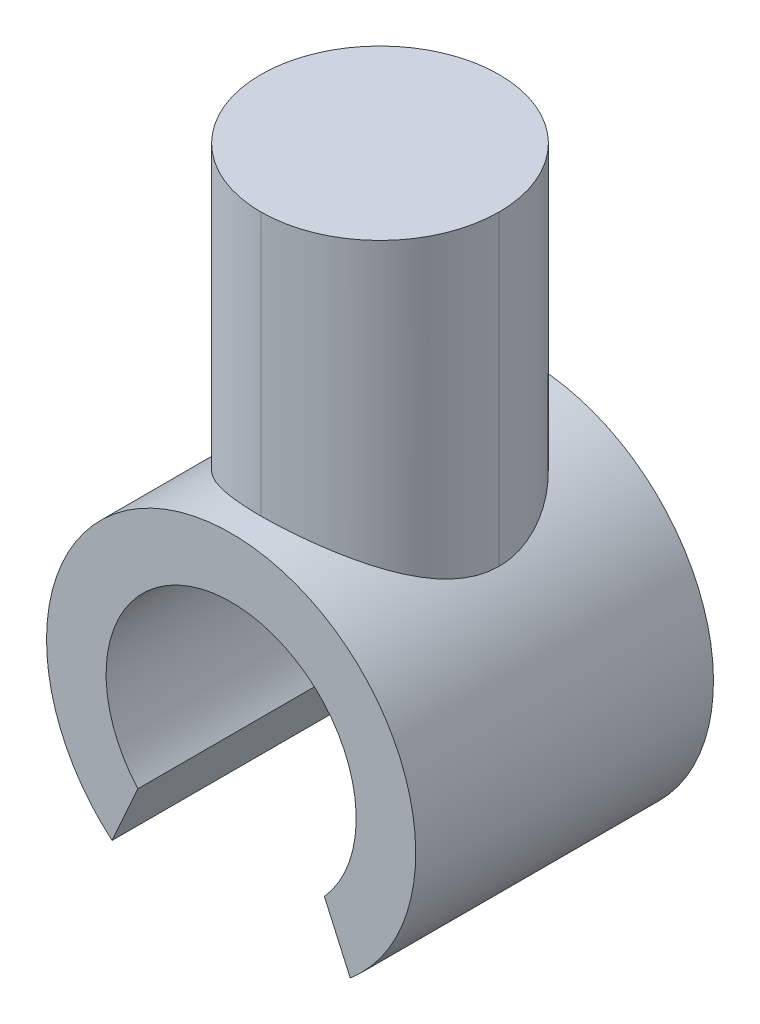
ISO-10303-21;
HEADER;
FILE_DESCRIPTION(('STEP AP214'),'2;1');
FILE_NAME('part.step','',(''),(''),'','','');
FILE_SCHEMA(('AUTOMOTIVE_DESIGN { 1 0 10303 214 1 1 1 1 }'));
ENDSEC;
DATA;
#1=APPLICATION_CONTEXT('core data for automotive mechanical design processes');
#2=APPLICATION_PROTOCOL_DEFINITION('international standard','automotive_design',2000,#1);
#3=PRODUCT_CONTEXT('',#1,'mechanical');
#4=PRODUCT('Part','Part','',(#3));
#5=PRODUCT_RELATED_PRODUCT_CATEGORY('part','',(#4));
#6=PRODUCT_DEFINITION_FORMATION('','',#4);
#7=PRODUCT_DEFINITION_CONTEXT('part definition',#1,'design');
#8=PRODUCT_DEFINITION('design','',#6,#7);
#9=PRODUCT_DEFINITION_SHAPE('','',#8);
#10=(LENGTH_UNIT() NAMED_UNIT(*) SI_UNIT(.MILLI.,.METRE.));
#11=(NAMED_UNIT(*) PLANE_ANGLE_UNIT() SI_UNIT($,.RADIAN.));
#12=(NAMED_UNIT(*) SI_UNIT($,.STERADIAN.) SOLID_ANGLE_UNIT());
#13=UNCERTAINTY_MEASURE_WITH_UNIT(LENGTH_MEASURE(1.E-05),#10,'distance_accuracy_value','');
#14=(GEOMETRIC_REPRESENTATION_CONTEXT(3) GLOBAL_UNCERTAINTY_ASSIGNED_CONTEXT((#13)) GLOBAL_UNIT_ASSIGNED_CONTEXT((#10,
#11,#12)) REPRESENTATION_CONTEXT('',''));
#15=CARTESIAN_POINT('',(0.,0.,0.));
#16=DIRECTION('',(0.,0.,1.));
#17=DIRECTION('',(1.,0.,0.));
#18=AXIS2_PLACEMENT_3D('',#15,#16,#17);
#19=CARTESIAN_POINT('',(0.,112.321608040201,101.6));
#20=DIRECTION('',(0.,-1.,0.));
#21=DIRECTION('',(1.,0.,0.));
#22=AXIS2_PLACEMENT_3D('',#19,#20,#21);
#23=PLANE('',#22);
#24=CARTESIAN_POINT('',(0.,112.321608040201,50.8));
#25=DIRECTION('',(0.,-1.,0.));
#26=DIRECTION('',(1.,0.,0.));
#27=AXIS2_PLACEMENT_3D('',#24,#25,#26);
#28=CIRCLE('',#27,50.8);
#29=CARTESIAN_POINT('',(-50.8,112.321608040201,50.8));
#30=VERTEX_POINT('',#29);
#31=CARTESIAN_POINT('',(0.,112.321608040201,101.6));
#32=VERTEX_POINT('',#31);
#33=EDGE_CURVE('E145',#30,#32,#28,.F.);
#34=ORIENTED_EDGE('',*,*,#33,.T.);
#35=CARTESIAN_POINT('',(0.,112.321608040201,50.8));
#36=DIRECTION('',(0.,-1.,0.));
#37=DIRECTION('',(1.,0.,0.));
#38=AXIS2_PLACEMENT_3D('',#35,#36,#37);
#39=CIRCLE('',#38,50.8);
#40=CARTESIAN_POINT('',(50.8,112.321608040201,50.8));
#41=VERTEX_POINT('',#40);
#42=EDGE_CURVE('E149',#32,#41,#39,.F.);
#43=ORIENTED_EDGE('',*,*,#42,.T.);
#44=CARTESIAN_POINT('',(0.,112.321608040201,50.8));
#45=DIRECTION('',(0.,-1.,0.));
#46=DIRECTION('',(1.,0.,0.));
#47=AXIS2_PLACEMENT_3D('',#44,#45,#46);
#48=CIRCLE('',#47,50.8);
#49=CARTESIAN_POINT('',(0.,112.321608040201,0.));
#50=VERTEX_POINT('',#49);
#51=EDGE_CURVE('E147',#41,#50,#48,.F.);
#52=ORIENTED_EDGE('',*,*,#51,.T.);
#53=CARTESIAN_POINT('',(0.,112.321608040201,50.8));
#54=DIRECTION('',(0.,-1.,0.));
#55=DIRECTION('',(1.,0.,0.));
#56=AXIS2_PLACEMENT_3D('',#53,#54,#55);
#57=CIRCLE('',#56,50.8);
#58=EDGE_CURVE('E143',#50,#30,#57,.F.);
#59=ORIENTED_EDGE('',*,*,#58,.T.);
#60=EDGE_LOOP('',(#34,#43,#52,#59));
#61=FACE_BOUND('',#60,.T.);
#62=ADVANCED_FACE('F35',(#61),#23,.F.);
#63=CARTESIAN_POINT('',(-50.8,-138.901013954221,101.6));
#64=DIRECTION('',(-0.912748600700166,0.408521715359036,0.));
#65=DIRECTION('',(-0.408521715359036,-0.912748600700166,0.));
#66=AXIS2_PLACEMENT_3D('',#63,#64,#65);
#67=PLANE('',#66);
#68=DIRECTION('',(0.,0.,-1.));
#69=VECTOR('',#68,1.);
#70=CARTESIAN_POINT('',(-50.8,-138.901013954221,101.6));
#71=LINE('',#70,#69);
#72=CARTESIAN_POINT('',(-50.8,-138.901013954221,114.3));
#73=VERTEX_POINT('',#72);
#74=CARTESIAN_POINT('',(-50.8,-138.901013954221,-12.7));
#75=VERTEX_POINT('',#74);
#76=EDGE_CURVE('E141',#73,#75,#71,.T.);
#77=ORIENTED_EDGE('',*,*,#76,.T.);
#78=DIRECTION('',(-0.408521715359036,-0.912748600700166,0.));
#79=VECTOR('',#78,1.);
#80=CARTESIAN_POINT('',(9.47109165085962,-4.23900579476519,-12.7));
#81=LINE('',#80,#79);
#82=CARTESIAN_POINT('',(-39.7785849336105,-114.276175661986,-12.7));
#83=VERTEX_POINT('',#82);
#84=EDGE_CURVE('E123',#83,#75,#81,.T.);
#85=ORIENTED_EDGE('',*,*,#84,.F.);
#86=DIRECTION('',(0.,0.,-1.));
#87=VECTOR('',#86,1.);
#88=CARTESIAN_POINT('',(-39.7785849336105,-114.276175661986,101.6));
#89=LINE('',#88,#87);
#90=CARTESIAN_POINT('',(-39.7785849336105,-114.276175661986,114.3));
#91=VERTEX_POINT('',#90);
#92=EDGE_CURVE('E139',#91,#83,#89,.T.);
#93=ORIENTED_EDGE('',*,*,#92,.F.);
#94=DIRECTION('',(0.408521715359036,0.912748600700166,0.));
#95=VECTOR('',#94,1.);
#96=CARTESIAN_POINT('',(9.47109165085962,-4.23900579476519,114.3));
#97=LINE('',#96,#95);
#98=EDGE_CURVE('E131',#73,#91,#97,.T.);
#99=ORIENTED_EDGE('',*,*,#98,.F.);
#100=EDGE_LOOP('',(#77,#85,#93,#99));
#101=FACE_BOUND('',#100,.T.);
#102=ADVANCED_FACE('F204',(#101),#67,.F.);
#103=CARTESIAN_POINT('',(0.,-78.74,101.6));
#104=DIRECTION('',(0.,0.,-1.));
#105=DIRECTION('',(-1.,0.,0.));
#106=AXIS2_PLACEMENT_3D('',#103,#104,#105);
#107=CYLINDRICAL_SURFACE('',#106,53.34);
#108=ORIENTED_EDGE('',*,*,#92,.T.);
#109=CARTESIAN_POINT('',(0.,-78.74,-12.7));
#110=DIRECTION('',(0.,0.,-1.));
#111=DIRECTION('',(-1.,0.,0.));
#112=AXIS2_PLACEMENT_3D('',#109,#110,#111);
#113=CIRCLE('',#112,53.34);
#114=CARTESIAN_POINT('',(39.7785849336105,-114.276175661986,-12.7));
#115=VERTEX_POINT('',#114);
#116=EDGE_CURVE('E118',#115,#83,#113,.F.);
#117=ORIENTED_EDGE('',*,*,#116,.F.);
#118=DIRECTION('',(0.,0.,-1.));
#119=VECTOR('',#118,1.);
#120=CARTESIAN_POINT('',(39.7785849336105,-114.276175661986,101.6));
#121=LINE('',#120,#119);
#122=CARTESIAN_POINT('',(39.7785849336105,-114.276175661986,114.3));
#123=VERTEX_POINT('',#122);
#124=EDGE_CURVE('E109',#123,#115,#121,.T.);
#125=ORIENTED_EDGE('',*,*,#124,.F.);
#126=CARTESIAN_POINT('',(0.,-78.74,114.3));
#127=DIRECTION('',(0.,0.,1.));
#128=DIRECTION('',(1.,0.,0.));
#129=AXIS2_PLACEMENT_3D('',#126,#127,#128);
#130=CIRCLE('',#129,53.34);
#131=EDGE_CURVE('E134',#91,#123,#130,.F.);
#132=ORIENTED_EDGE('',*,*,#131,.F.);
#133=EDGE_LOOP('',(#108,#117,#125,#132));
#134=FACE_BOUND('',#133,.T.);
#135=ADVANCED_FACE('F208',(#134),#107,.F.);
#136=CARTESIAN_POINT('',(50.8,-138.901013954221,101.6));
#137=DIRECTION('',(0.912748600700166,0.408521715359036,0.));
#138=DIRECTION('',(-0.408521715359036,0.912748600700166,0.));
#139=AXIS2_PLACEMENT_3D('',#136,#137,#138);
#140=PLANE('',#139);
#141=ORIENTED_EDGE('',*,*,#124,.T.);
#142=DIRECTION('',(-0.408521715359036,0.912748600700166,0.));
#143=VECTOR('',#142,1.);
#144=CARTESIAN_POINT('',(-9.47109165085962,-4.23900579476519,-12.7));
#145=LINE('',#144,#143);
#146=CARTESIAN_POINT('',(50.8,-138.901013954221,-12.7));
#147=VERTEX_POINT('',#146);
#148=EDGE_CURVE('E113',#147,#115,#145,.T.);
#149=ORIENTED_EDGE('',*,*,#148,.F.);
#150=DIRECTION('',(0.,0.,-1.));
#151=VECTOR('',#150,1.);
#152=CARTESIAN_POINT('',(50.8,-138.901013954221,101.6));
#153=LINE('',#152,#151);
#154=CARTESIAN_POINT('',(50.8,-138.901013954221,114.3));
#155=VERTEX_POINT('',#154);
#156=EDGE_CURVE('E99',#155,#147,#153,.T.);
#157=ORIENTED_EDGE('',*,*,#156,.F.);
#158=DIRECTION('',(0.408521715359036,-0.912748600700166,0.));
#159=VECTOR('',#158,1.);
#160=CARTESIAN_POINT('',(-9.47109165085962,-4.23900579476519,114.3));
#161=LINE('',#160,#159);
#162=EDGE_CURVE('E110',#123,#155,#161,.T.);
#163=ORIENTED_EDGE('',*,*,#162,.F.);
#164=EDGE_LOOP('',(#141,#149,#157,#163));
#165=FACE_BOUND('',#164,.T.);
#166=ADVANCED_FACE('F114',(#165),#140,.F.);
#167=CARTESIAN_POINT('',(0.,-78.74,101.6));
#168=DIRECTION('',(0.,0.,-1.));
#169=DIRECTION('',(-1.,0.,0.));
#170=AXIS2_PLACEMENT_3D('',#167,#168,#169);
#171=CYLINDRICAL_SURFACE('',#170,78.74);
#172=CARTESIAN_POINT('',(0.,0.,101.6));
#173=CARTESIAN_POINT('',(-0.644595127487902,1.72194127727164E-05,101.600015762356));
#174=CARTESIAN_POINT('',(-1.28917981317422,-0.00791498103389175,101.587731492174));
#175=CARTESIAN_POINT('',(-2.57700747964004,-0.0395502751363938,101.538681799376));
#176=CARTESIAN_POINT('',(-3.2202505068212,-0.0632528139839544,101.501917237988));
#177=CARTESIAN_POINT('',(-4.50377437533952,-0.126283903366531,101.404052179972));
#178=CARTESIAN_POINT('',(-5.1440566235609,-0.165604044306975,101.342964780394));
#179=CARTESIAN_POINT('',(-6.4206840125599,-0.259605598884005,101.19670420074));
#180=CARTESIAN_POINT('',(-7.0570291376285,-0.314287073771588,101.111530924625));
#181=CARTESIAN_POINT('',(-8.95086479150597,-0.500171621183777,100.821451516919));
#182=CARTESIAN_POINT('',(-10.2010381967516,-0.653608752181517,100.581378823982));
#183=CARTESIAN_POINT('',(-12.6720413490053,-1.01633819477934,100.01045029498));
#184=CARTESIAN_POINT('',(-13.8928683891921,-1.22563563738302,99.6795861192587));
#185=CARTESIAN_POINT('',(-16.295242624408,-1.6948989154569,98.9319490693241));
#186=CARTESIAN_POINT('',(-17.476860018057,-1.95476776389424,98.515340550887));
#187=CARTESIAN_POINT('',(-19.7967009029593,-2.51989881186177,97.6004869927745));
#188=CARTESIAN_POINT('',(-20.9349247142763,-2.8251606764992,97.1022425553755));
#189=CARTESIAN_POINT('',(-23.1639179892367,-3.47533517749043,96.0283647518095));
#190=CARTESIAN_POINT('',(-24.2546377133551,-3.82028805911185,95.4526527342944));
#191=CARTESIAN_POINT('',(-26.3832573743792,-4.54313344906285,94.2289207138964));
#192=CARTESIAN_POINT('',(-27.4211548808569,-4.9210274708966,93.5808973882354));
#193=CARTESIAN_POINT('',(-29.5232487271058,-5.73495174512418,92.161272665498));
#194=CARTESIAN_POINT('',(-30.5826863009676,-6.17320983529882,91.383902967643));
#195=CARTESIAN_POINT('',(-32.632653680722,-7.07166548620315,89.7546461203724));
#196=CARTESIAN_POINT('',(-33.6231804868962,-7.53186400054213,88.9027557306753));
#197=CARTESIAN_POINT('',(-35.5341166629751,-8.46591572574818,87.1272668097686));
#198=CARTESIAN_POINT('',(-36.4544107967588,-8.93978969117634,86.2035552440889));
#199=CARTESIAN_POINT('',(-38.2205790815629,-9.89102608215534,84.2891576267543));
#200=CARTESIAN_POINT('',(-39.0664481772528,-10.3683887422947,83.2984670336105));
#201=CARTESIAN_POINT('',(-40.8001263111165,-11.3865229213014,81.1022271262103));
#202=CARTESIAN_POINT('',(-41.6757373597915,-11.9262686380215,79.8865328561015));
#203=CARTESIAN_POINT('',(-43.3206850765822,-12.9808888444224,77.3746580499992));
#204=CARTESIAN_POINT('',(-44.0900044255098,-13.4957592720521,76.0784644471872));
#205=CARTESIAN_POINT('',(-45.5135358071298,-14.4807427546301,73.414808694625));
#206=CARTESIAN_POINT('',(-46.1681674366849,-14.9510159466449,72.0476311135842));
#207=CARTESIAN_POINT('',(-47.3582676869882,-15.8295115493316,69.2432486140708));
#208=CARTESIAN_POINT('',(-47.8937659823205,-16.2377494041615,67.8060612431038));
#209=CARTESIAN_POINT('',(-48.7588602344353,-16.9111207826286,65.1131909517686));
#210=CARTESIAN_POINT('',(-49.1078737857655,-17.1887585950079,63.8669186313269));
#211=CARTESIAN_POINT('',(-49.5607333563233,-17.5537386322513,61.9712195515278));
#212=CARTESIAN_POINT('',(-49.6999042313938,-17.6668145530944,61.3349726246345));
#213=CARTESIAN_POINT('',(-49.9541345173324,-17.8745822030896,60.0547358399866));
#214=CARTESIAN_POINT('',(-50.0691968726617,-17.9692761771918,59.4107469379582));
#215=CARTESIAN_POINT('',(-50.2757360834767,-18.1400320049135,58.1095067541472));
#216=CARTESIAN_POINT('',(-50.3669531722141,-18.2158882306166,57.452187211763));
#217=CARTESIAN_POINT('',(-50.52372516195,-18.3466960454549,56.1324289803394));
#218=CARTESIAN_POINT('',(-50.5892805915411,-18.4016480651855,55.4699903970313));
#219=CARTESIAN_POINT('',(-50.6944352361314,-18.4899639820779,54.1405594330426));
#220=CARTESIAN_POINT('',(-50.7339933734702,-18.5232937133481,53.4735615201874));
#221=CARTESIAN_POINT('',(-50.7867910211404,-18.5678333117071,52.1377145960152));
#222=CARTESIAN_POINT('',(-50.8000275406393,-18.5790406651073,51.468865382987));
#223=CARTESIAN_POINT('',(-50.8,-18.5789860457788,50.8));
#224=B_SPLINE_CURVE_WITH_KNOTS('',3,(#172,#173,#174,#175,#176,#177,#178,#179,#180,#181,#182,
#183,#184,#185,#186,#187,#188,#189,#190,#191,#192,#193,#194,#195,#196,#197,#198,#199,#200,#201,
#202,#203,#204,#205,#206,#207,#208,#209,#210,#211,#212,#213,#214,#215,#216,#217,#218,#219,#220,
#221,#222,#223),.UNSPECIFIED.,.F.,.F.,(4,2,2,2,2,2,2,2,2,2,2,2,2,2,2,2,2,2,2,2,2,2,2,2,2,4),(0.,
1.93360075212872,3.86713348282667,5.7996264745076,7.73212717182168,11.5734655672471,
15.4151569272004,19.2495519458562,23.083918677177,26.9222081615332,30.7606740918812,
34.912193752306,39.0638940174119,43.222266031756,47.3809202863583,52.1525991159421,
56.9250545290785,61.6796672246388,66.4330942779096,70.3984631476608,72.3809367478311,
74.3631680799586,76.366169640614,78.3691299402013,80.3752475055163,82.3815930058712),.UNSPECIFIED.);
#225=CARTESIAN_POINT('',(0.,0.,101.6));
#226=VERTEX_POINT('',#225);
#227=CARTESIAN_POINT('',(-50.8,-18.5789860457788,50.8));
#228=VERTEX_POINT('',#227);
#229=EDGE_CURVE('E45',#226,#228,#224,.T.);
#230=ORIENTED_EDGE('',*,*,#229,.T.);
#231=CARTESIAN_POINT('',(-50.8,-18.5789860457788,50.8));
#232=CARTESIAN_POINT('',(-50.8000217935801,-18.5790292590639,50.1696045399548));
#233=CARTESIAN_POINT('',(-50.7882666382128,-18.5690791438263,49.5392212288442));
#234=CARTESIAN_POINT('',(-50.7413629980272,-18.5295073983138,48.2799976301733));
#235=CARTESIAN_POINT('',(-50.7062165706761,-18.4998874981693,47.6511572117845));
#236=CARTESIAN_POINT('',(-50.612746226813,-18.4213377147103,46.3971689468279));
#237=CARTESIAN_POINT('',(-50.5544497802079,-18.3724307180169,45.772017611837));
#238=CARTESIAN_POINT('',(-50.4149802629152,-18.2559056739909,44.5260269482026));
#239=CARTESIAN_POINT('',(-50.3338068743576,-18.1882873666691,43.9051876795972));
#240=CARTESIAN_POINT('',(-50.1498352587882,-18.035834156762,42.674902244952));
#241=CARTESIAN_POINT('',(-50.0472473502577,-17.9511669631224,42.0654038395902));
#242=CARTESIAN_POINT('',(-49.8204524396543,-17.7651564388961,40.8529865210911));
#243=CARTESIAN_POINT('',(-49.6962429266837,-17.6638111715742,40.2500683807655));
#244=CARTESIAN_POINT('',(-49.2918777743477,-17.3362597731672,38.4525911110651));
#245=CARTESIAN_POINT('',(-48.9799756089565,-17.0865297026785,37.2692432919542));
#246=CARTESIAN_POINT('',(-48.2776841129369,-16.535091352059,34.9452560676745));
#247=CARTESIAN_POINT('',(-47.8876685785209,-16.2336315626922,33.8044428433027));
#248=CARTESIAN_POINT('',(-47.0325086592526,-15.5876625969593,31.5640797760975));
#249=CARTESIAN_POINT('',(-46.5673674995658,-15.2431552687805,30.4645281643869));
#250=CARTESIAN_POINT('',(-45.5645840074538,-14.5197592916671,28.3071690235977));
#251=CARTESIAN_POINT('',(-45.0267608078789,-14.1407856693619,27.2494744261105));
#252=CARTESIAN_POINT('',(-43.8828990230019,-13.3583588604385,25.1811002286674));
#253=CARTESIAN_POINT('',(-43.2768555333331,-12.9549039148166,24.1704240162611));
#254=CARTESIAN_POINT('',(-41.9080245051335,-12.0732242513655,22.0569793124689));
#255=CARTESIAN_POINT('',(-41.135215644946,-11.5925579365082,20.9617100593523));
#256=CARTESIAN_POINT('',(-39.5077238965212,-10.6222702631414,18.8379962347019));
#257=CARTESIAN_POINT('',(-38.6530356739941,-10.132648322873,17.8095560242925));
#258=CARTESIAN_POINT('',(-36.8643511584817,-9.1551858855226,15.8221845728278));
#259=CARTESIAN_POINT('',(-35.9303179870913,-8.66734632795234,14.8632860418264));
#260=CARTESIAN_POINT('',(-33.9860352743183,-7.70399360238174,13.0192564150536));
#261=CARTESIAN_POINT('',(-32.9757813572445,-7.22848114416595,12.1341295605255));
#262=CARTESIAN_POINT('',(-30.7426427348552,-6.23785279894497,10.3295669951929));
#263=CARTESIAN_POINT('',(-29.5093510088161,-5.72588485414536,9.42123414715904));
#264=CARTESIAN_POINT('',(-26.9534169598684,-4.74423033194106,7.7127026499261));
#265=CARTESIAN_POINT('',(-25.6307630218865,-4.2745492694558,6.91251809828039));
#266=CARTESIAN_POINT('',(-23.5871799433737,-3.612476082304,5.80127669634251));
#267=CARTESIAN_POINT('',(-22.8967338445303,-3.39904184988107,5.44599657914169));
#268=CARTESIAN_POINT('',(-21.4965604112457,-2.98765642827428,4.76584540690825));
#269=CARTESIAN_POINT('',(-20.7868356661201,-2.78970317355814,4.4409702939799));
#270=CARTESIAN_POINT('',(-19.34940060147,-2.41084010857459,3.82284948478672));
#271=CARTESIAN_POINT('',(-18.6216927578158,-2.22992796844839,3.52959946394711));
#272=CARTESIAN_POINT('',(-17.1497143924915,-1.88659257681002,2.97588739006822));
#273=CARTESIAN_POINT('',(-16.405444782094,-1.72416831103826,2.71542353827037));
#274=CARTESIAN_POINT('',(-14.4114000875961,-1.31969037572935,2.06956191739555));
#275=CARTESIAN_POINT('',(-13.1484654817676,-1.09477635698615,1.71344903147552));
#276=CARTESIAN_POINT('',(-10.5902269557219,-0.704701798090394,1.09872539366298));
#277=CARTESIAN_POINT('',(-9.29493146186089,-0.539525872753171,0.840089536427839));
#278=CARTESIAN_POINT('',(-7.3308976214759,-0.339211780620884,0.527321790786015));
#279=CARTESIAN_POINT('',(-6.67034749837672,-0.280226088996718,0.435408022752026));
#280=CARTESIAN_POINT('',(-5.34484181646866,-0.178801981351995,0.277550065358214));
#281=CARTESIAN_POINT('',(-4.67988629171895,-0.136363437553083,0.211605675460807));
#282=CARTESIAN_POINT('',(-3.34653431903648,-0.068314365077005,0.105934972633952));
#283=CARTESIAN_POINT('',(-2.67813563321699,-0.0427166979494259,0.0662286979194417));
#284=CARTESIAN_POINT('',(-1.33982857256763,-0.00854906425338873,0.0132513877063426));
#285=CARTESIAN_POINT('',(-0.669920132592762,2.01528976125231E-05,-1.84843334125881E-05));
#286=CARTESIAN_POINT('',(0.,0.,0.));
#287=B_SPLINE_CURVE_WITH_KNOTS('',3,(#231,#232,#233,#234,#235,#236,#237,#238,#239,#240,#241,
#242,#243,#244,#245,#246,#247,#248,#249,#250,#251,#252,#253,#254,#255,#256,#257,#258,#259,#260,
#261,#262,#263,#264,#265,#266,#267,#268,#269,#270,#271,#272,#273,#274,#275,#276,#277,#278,#279,
#280,#281,#282,#283,#284,#285,#286),.UNSPECIFIED.,.F.,.F.,(4,2,2,2,2,2,2,2,2,2,2,2,2,2,2,2,2,2,
2,2,2,2,2,2,2,2,2,4),(0.,1.89097883972072,3.78179137326102,5.67036693329819,7.55896873596314,
9.42982808150528,11.3009048334086,15.0428577388777,18.7673146288637,22.4916116692863,
26.2253532952958,29.9593635121709,34.2273583523017,38.4956314337711,42.765899317452,
47.0364125360752,51.8750936149004,56.7144048276404,59.1294906515866,61.5442536936787,
63.9586861090553,66.3729860028298,70.3616069943113,74.3492000078352,76.3571487164616,
78.3650819192456,80.3745468265135,82.3841001678275),.UNSPECIFIED.);
#288=CARTESIAN_POINT('',(0.,0.,0.));
#289=VERTEX_POINT('',#288);
#290=EDGE_CURVE('E11',#228,#289,#287,.T.);
#291=ORIENTED_EDGE('',*,*,#290,.T.);
#292=CARTESIAN_POINT('',(0.,0.,0.));
#293=CARTESIAN_POINT('',(0.644595127487905,1.72194127710973E-05,-1.57623558967319E-05));
#294=CARTESIAN_POINT('',(1.28917981317422,-0.00791498103388519,0.0122685078261093));
#295=CARTESIAN_POINT('',(2.57700747964004,-0.0395502751363853,0.061318200624322));
#296=CARTESIAN_POINT('',(3.2202505068212,-0.0632528139839521,0.0980827620118554));
#297=CARTESIAN_POINT('',(4.50377437533952,-0.126283903366534,0.19594782002837));
#298=CARTESIAN_POINT('',(5.1440566235609,-0.165604044306977,0.257035219606335));
#299=CARTESIAN_POINT('',(6.4206840125599,-0.259605598884008,0.40329579926032));
#300=CARTESIAN_POINT('',(7.0570291376285,-0.314287073771594,0.488469075375142));
#301=CARTESIAN_POINT('',(8.95086479150597,-0.500171621183785,0.778548483080836));
#302=CARTESIAN_POINT('',(10.2010381967516,-0.653608752181521,1.01862117601807));
#303=CARTESIAN_POINT('',(12.6720413490053,-1.01633819477934,1.58954970502));
#304=CARTESIAN_POINT('',(13.8928683891921,-1.22563563738302,1.92041388074129));
#305=CARTESIAN_POINT('',(16.295242624408,-1.6948989154569,2.66805093067592));
#306=CARTESIAN_POINT('',(17.476860018057,-1.95476776389424,3.08465944911295));
#307=CARTESIAN_POINT('',(19.7967009029593,-2.51989881186177,3.99951300722554));
#308=CARTESIAN_POINT('',(20.9349247142764,-2.8251606764992,4.49775744462446));
#309=CARTESIAN_POINT('',(23.1639179892367,-3.47533517749043,5.57163524819049));
#310=CARTESIAN_POINT('',(24.2546377133551,-3.82028805911186,6.14734726570563));
#311=CARTESIAN_POINT('',(26.3832573743792,-4.54313344906287,7.37107928610363));
#312=CARTESIAN_POINT('',(27.4211548808569,-4.9210274708966,8.01910261176464));
#313=CARTESIAN_POINT('',(29.5232487271058,-5.73495174512418,9.438727334502));
#314=CARTESIAN_POINT('',(30.5826863009677,-6.17320983529882,10.216097032357));
#315=CARTESIAN_POINT('',(32.632653680722,-7.07166548620315,11.8453538796276));
#316=CARTESIAN_POINT('',(33.6231804868962,-7.53186400054213,12.6972442693247));
#317=CARTESIAN_POINT('',(35.5341166629751,-8.46591572574818,14.4727331902314));
#318=CARTESIAN_POINT('',(36.4544107967588,-8.93978969117634,15.3964447559111));
#319=CARTESIAN_POINT('',(38.2205790815629,-9.89102608215534,17.3108423732457));
#320=CARTESIAN_POINT('',(39.0664481772528,-10.3683887422947,18.3015329663896));
#321=CARTESIAN_POINT('',(40.8001263111165,-11.3865229213014,20.4977728737898));
#322=CARTESIAN_POINT('',(41.6757373597915,-11.9262686380215,21.7134671438985));
#323=CARTESIAN_POINT('',(43.3206850765822,-12.9808888444224,24.2253419500008));
#324=CARTESIAN_POINT('',(44.0900044255098,-13.4957592720521,25.5215355528128));
#325=CARTESIAN_POINT('',(45.5135358071298,-14.4807427546301,28.185191305375));
#326=CARTESIAN_POINT('',(46.1681674366849,-14.9510159466449,29.5523688864158));
#327=CARTESIAN_POINT('',(47.3582676869882,-15.8295115493316,32.3567513859292));
#328=CARTESIAN_POINT('',(47.8937659823205,-16.2377494041615,33.7939387568962));
#329=CARTESIAN_POINT('',(48.7588602344353,-16.9111207826286,36.4868090482314));
#330=CARTESIAN_POINT('',(49.1078737857655,-17.1887585950079,37.7330813686731));
#331=CARTESIAN_POINT('',(49.5607333563233,-17.5537386322513,39.6287804484722));
#332=CARTESIAN_POINT('',(49.6999042313938,-17.6668145530944,40.2650273753655));
#333=CARTESIAN_POINT('',(49.9541345173324,-17.8745822030896,41.5452641600134));
#334=CARTESIAN_POINT('',(50.0691968726617,-17.9692761771918,42.1892530620418));
#335=CARTESIAN_POINT('',(50.2757360834767,-18.1400320049135,43.4904932458528));
#336=CARTESIAN_POINT('',(50.3669531722141,-18.2158882306166,44.147812788237));
#337=CARTESIAN_POINT('',(50.52372516195,-18.3466960454549,45.4675710196607));
#338=CARTESIAN_POINT('',(50.5892805915411,-18.4016480651855,46.1300096029687));
#339=CARTESIAN_POINT('',(50.6944352361314,-18.4899639820779,47.4594405669574));
#340=CARTESIAN_POINT('',(50.7339933734702,-18.5232937133481,48.1264384798126));
#341=CARTESIAN_POINT('',(50.7867910211404,-18.5678333117072,49.4622854039848));
#342=CARTESIAN_POINT('',(50.8000275406393,-18.5790406651073,50.131134617013));
#343=CARTESIAN_POINT('',(50.8,-18.5789860457787,50.8));
#344=B_SPLINE_CURVE_WITH_KNOTS('',3,(#292,#293,#294,#295,#296,#297,#298,#299,#300,#301,#302,
#303,#304,#305,#306,#307,#308,#309,#310,#311,#312,#313,#314,#315,#316,#317,#318,#319,#320,#321,
#322,#323,#324,#325,#326,#327,#328,#329,#330,#331,#332,#333,#334,#335,#336,#337,#338,#339,#340,
#341,#342,#343),.UNSPECIFIED.,.F.,.F.,(4,2,2,2,2,2,2,2,2,2,2,2,2,2,2,2,2,2,2,2,2,2,2,2,2,4),(0.,
1.93360075212872,3.86713348282667,5.7996264745076,7.73212717182168,11.5734655672471,
15.4151569272004,19.2495519458563,23.083918677177,26.9222081615332,30.7606740918812,
34.912193752306,39.0638940174119,43.222266031756,47.3809202863583,52.1525991159421,
56.9250545290785,61.6796672246388,66.4330942779096,70.3984631476608,72.3809367478311,
74.3631680799586,76.366169640614,78.3691299402013,80.3752475055163,82.3815930058712),.UNSPECIFIED.);
#345=CARTESIAN_POINT('',(50.8,-18.5789860457788,50.8));
#346=VERTEX_POINT('',#345);
#347=EDGE_CURVE('E159',#289,#346,#344,.T.);
#348=ORIENTED_EDGE('',*,*,#347,.T.);
#349=CARTESIAN_POINT('',(50.8,-18.5789860457788,50.8));
#350=CARTESIAN_POINT('',(50.8000217935801,-18.5790292590639,51.4303954600451));
#351=CARTESIAN_POINT('',(50.7882666382128,-18.5690791438263,52.0607787711558));
#352=CARTESIAN_POINT('',(50.7413629980272,-18.5295073983138,53.3200023698267));
#353=CARTESIAN_POINT('',(50.7062165706761,-18.4998874981693,53.9488427882155));
#354=CARTESIAN_POINT('',(50.612746226813,-18.4213377147103,55.2028310531721));
#355=CARTESIAN_POINT('',(50.5544497802079,-18.3724307180169,55.827982388163));
#356=CARTESIAN_POINT('',(50.4149802629152,-18.2559056739909,57.0739730517974));
#357=CARTESIAN_POINT('',(50.3338068743576,-18.1882873666691,57.6948123204028));
#358=CARTESIAN_POINT('',(50.1498352587882,-18.035834156762,58.925097755048));
#359=CARTESIAN_POINT('',(50.0472473502577,-17.9511669631224,59.5345961604098));
#360=CARTESIAN_POINT('',(49.8204524396543,-17.7651564388961,60.7470134789089));
#361=CARTESIAN_POINT('',(49.6962429266837,-17.6638111715742,61.3499316192345));
#362=CARTESIAN_POINT('',(49.2918777743477,-17.3362597731672,63.1474088889349));
#363=CARTESIAN_POINT('',(48.9799756089565,-17.0865297026785,64.3307567080458));
#364=CARTESIAN_POINT('',(48.2776841129369,-16.5350913520591,66.6547439323255));
#365=CARTESIAN_POINT('',(47.8876685785209,-16.2336315626922,67.7955571566973));
#366=CARTESIAN_POINT('',(47.0325086592526,-15.5876625969593,70.0359202239025));
#367=CARTESIAN_POINT('',(46.5673674995658,-15.2431552687805,71.1354718356131));
#368=CARTESIAN_POINT('',(45.5645840074538,-14.5197592916671,73.2928309764022));
#369=CARTESIAN_POINT('',(45.0267608078789,-14.1407856693619,74.3505255738895));
#370=CARTESIAN_POINT('',(43.8828990230019,-13.3583588604385,76.4188997713326));
#371=CARTESIAN_POINT('',(43.2768555333331,-12.9549039148166,77.4295759837389));
#372=CARTESIAN_POINT('',(41.9080245051335,-12.0732242513655,79.5430206875311));
#373=CARTESIAN_POINT('',(41.135215644946,-11.5925579365082,80.6382899406477));
#374=CARTESIAN_POINT('',(39.5077238965212,-10.6222702631414,82.7620037652981));
#375=CARTESIAN_POINT('',(38.6530356739941,-10.132648322873,83.7904439757075));
#376=CARTESIAN_POINT('',(36.8643511584817,-9.1551858855226,85.7778154271722));
#377=CARTESIAN_POINT('',(35.9303179870913,-8.66734632795233,86.7367139581736));
#378=CARTESIAN_POINT('',(33.9860352743183,-7.70399360238173,88.5807435849464));
#379=CARTESIAN_POINT('',(32.9757813572445,-7.22848114416595,89.4658704394745));
#380=CARTESIAN_POINT('',(30.7426427348552,-6.23785279894496,91.2704330048072));
#381=CARTESIAN_POINT('',(29.5093510088161,-5.72588485414535,92.178765852841));
#382=CARTESIAN_POINT('',(26.9534169598684,-4.74423033194105,93.8872973500739));
#383=CARTESIAN_POINT('',(25.6307630218864,-4.2745492694558,94.6874819017196));
#384=CARTESIAN_POINT('',(23.5871799433737,-3.612476082304,95.7987233036575));
#385=CARTESIAN_POINT('',(22.8967338445303,-3.39904184988107,96.1540034208583));
#386=CARTESIAN_POINT('',(21.4965604112457,-2.98765642827428,96.8341545930917));
#387=CARTESIAN_POINT('',(20.7868356661201,-2.78970317355814,97.1590297060201));
#388=CARTESIAN_POINT('',(19.34940060147,-2.4108401085746,97.7771505152133));
#389=CARTESIAN_POINT('',(18.6216927578157,-2.22992796844841,98.0704005360529));
#390=CARTESIAN_POINT('',(17.1497143924915,-1.88659257681003,98.6241126099318));
#391=CARTESIAN_POINT('',(16.405444782094,-1.72416831103824,98.8845764617296));
#392=CARTESIAN_POINT('',(14.4114000875961,-1.31969037572932,99.5304380826044));
#393=CARTESIAN_POINT('',(13.1484654817676,-1.09477635698615,99.8865509685245));
#394=CARTESIAN_POINT('',(10.5902269557219,-0.704701798090399,100.501274606337));
#395=CARTESIAN_POINT('',(9.2949314618609,-0.539525872753154,100.759910463572));
#396=CARTESIAN_POINT('',(7.33089762147591,-0.339211780620891,101.072678209214));
#397=CARTESIAN_POINT('',(6.67034749837672,-0.280226088996743,101.164591977248));
#398=CARTESIAN_POINT('',(5.34484181646865,-0.178801981352016,101.322449934642));
#399=CARTESIAN_POINT('',(4.67988629171894,-0.136363437553082,101.388394324539));
#400=CARTESIAN_POINT('',(3.34653431903646,-0.0683143650769948,101.494065027366));
#401=CARTESIAN_POINT('',(2.67813563321697,-0.0427166979494287,101.533771302081));
#402=CARTESIAN_POINT('',(1.33982857256761,-0.00854906425341001,101.586748612294));
#403=CARTESIAN_POINT('',(0.669920132592745,2.01528975857162E-05,101.600018484333));
#404=CARTESIAN_POINT('',(0.,0.,101.6));
#405=B_SPLINE_CURVE_WITH_KNOTS('',3,(#349,#350,#351,#352,#353,#354,#355,#356,#357,#358,#359,
#360,#361,#362,#363,#364,#365,#366,#367,#368,#369,#370,#371,#372,#373,#374,#375,#376,#377,#378,
#379,#380,#381,#382,#383,#384,#385,#386,#387,#388,#389,#390,#391,#392,#393,#394,#395,#396,#397,
#398,#399,#400,#401,#402,#403,#404),.UNSPECIFIED.,.F.,.F.,(4,2,2,2,2,2,2,2,2,2,2,2,2,2,2,2,2,2,
2,2,2,2,2,2,2,2,2,4),(0.,1.89097883972072,3.78179137326103,5.67036693329819,7.55896873596314,
9.42982808150527,11.3009048334086,15.0428577388777,18.7673146288637,22.4916116692863,
26.2253532952958,29.9593635121709,34.2273583523017,38.4956314337711,42.765899317452,
47.0364125360751,51.8750936149005,56.7144048276404,59.1294906515866,61.5442536936787,
63.9586861090553,66.3729860028298,70.3616069943113,74.3492000078352,76.3571487164616,
78.3650819192457,80.3745468265135,82.3841001678275),.UNSPECIFIED.);
#406=EDGE_CURVE('E152',#346,#226,#405,.T.);
#407=ORIENTED_EDGE('',*,*,#406,.T.);
#408=EDGE_LOOP('',(#230,#291,#348,#407));
#409=FACE_BOUND('',#408,.T.);
#410=ORIENTED_EDGE('',*,*,#156,.T.);
#411=CARTESIAN_POINT('',(0.,-78.74,-12.7));
#412=DIRECTION('',(0.,0.,-1.));
#413=DIRECTION('',(-1.,0.,0.));
#414=AXIS2_PLACEMENT_3D('',#411,#412,#413);
#415=CIRCLE('',#414,78.74);
#416=EDGE_CURVE('E103',#147,#75,#415,.F.);
#417=ORIENTED_EDGE('',*,*,#416,.T.);
#418=ORIENTED_EDGE('',*,*,#76,.F.);
#419=CARTESIAN_POINT('',(0.,-78.74,114.3));
#420=DIRECTION('',(0.,0.,1.));
#421=DIRECTION('',(1.,0.,0.));
#422=AXIS2_PLACEMENT_3D('',#419,#420,#421);
#423=CIRCLE('',#422,78.74);
#424=EDGE_CURVE('E105',#73,#155,#423,.F.);
#425=ORIENTED_EDGE('',*,*,#424,.T.);
#426=EDGE_LOOP('',(#410,#417,#418,#425));
#427=FACE_BOUND('',#426,.T.);
#428=ADVANCED_FACE('F101',(#409,#427),#171,.T.);
#429=CARTESIAN_POINT('',(0.,0.,114.3));
#430=DIRECTION('',(0.,0.,1.));
#431=DIRECTION('',(1.,0.,0.));
#432=AXIS2_PLACEMENT_3D('',#429,#430,#431);
#433=PLANE('',#432);
#434=ORIENTED_EDGE('',*,*,#424,.F.);
#435=ORIENTED_EDGE('',*,*,#98,.T.);
#436=ORIENTED_EDGE('',*,*,#131,.T.);
#437=ORIENTED_EDGE('',*,*,#162,.T.);
#438=EDGE_LOOP('',(#434,#435,#436,#437));
#439=FACE_BOUND('',#438,.T.);
#440=ADVANCED_FACE('F219',(#439),#433,.T.);
#441=CARTESIAN_POINT('',(0.,0.,-12.7));
#442=DIRECTION('',(0.,0.,-1.));
#443=DIRECTION('',(-1.,0.,0.));
#444=AXIS2_PLACEMENT_3D('',#441,#442,#443);
#445=PLANE('',#444);
#446=ORIENTED_EDGE('',*,*,#416,.F.);
#447=ORIENTED_EDGE('',*,*,#148,.T.);
#448=ORIENTED_EDGE('',*,*,#116,.T.);
#449=ORIENTED_EDGE('',*,*,#84,.T.);
#450=EDGE_LOOP('',(#446,#447,#448,#449));
#451=FACE_BOUND('',#450,.T.);
#452=ADVANCED_FACE('F121',(#451),#445,.T.);
#453=CARTESIAN_POINT('',(0.,112.321608040201,50.8));
#454=DIRECTION('',(0.,1.,0.));
#455=DIRECTION('',(0.,0.,1.));
#456=AXIS2_PLACEMENT_3D('',#453,#454,#455);
#457=CYLINDRICAL_SURFACE('',#456,50.8);
#458=DIRECTION('',(0.,-1.,0.));
#459=VECTOR('',#458,1.);
#460=CARTESIAN_POINT('',(-50.8,-18.5789860457788,50.8));
#461=LINE('',#460,#459);
#462=EDGE_CURVE('E126',#30,#228,#461,.T.);
#463=ORIENTED_EDGE('',*,*,#462,.F.);
#464=ORIENTED_EDGE('',*,*,#58,.F.);
#465=DIRECTION('',(0.,-1.,0.));
#466=VECTOR('',#465,1.);
#467=CARTESIAN_POINT('',(0.,112.321608040201,0.));
#468=LINE('',#467,#466);
#469=EDGE_CURVE('E40',#289,#50,#468,.F.);
#470=ORIENTED_EDGE('',*,*,#469,.F.);
#471=ORIENTED_EDGE('',*,*,#290,.F.);
#472=EDGE_LOOP('',(#463,#464,#470,#471));
#473=FACE_BOUND('',#472,.T.);
#474=ADVANCED_FACE('F37',(#473),#457,.T.);
#475=CARTESIAN_POINT('',(0.,112.321608040201,50.8));
#476=DIRECTION('',(0.,-1.,0.));
#477=DIRECTION('',(0.,0.,-1.));
#478=AXIS2_PLACEMENT_3D('',#475,#476,#477);
#479=CYLINDRICAL_SURFACE('',#478,50.8);
#480=ORIENTED_EDGE('',*,*,#469,.T.);
#481=ORIENTED_EDGE('',*,*,#51,.F.);
#482=DIRECTION('',(0.,1.,0.));
#483=VECTOR('',#482,1.);
#484=CARTESIAN_POINT('',(50.8,112.321608040201,50.8));
#485=LINE('',#484,#483);
#486=EDGE_CURVE('E189',#346,#41,#485,.T.);
#487=ORIENTED_EDGE('',*,*,#486,.F.);
#488=ORIENTED_EDGE('',*,*,#347,.F.);
#489=EDGE_LOOP('',(#480,#481,#487,#488));
#490=FACE_BOUND('',#489,.T.);
#491=ADVANCED_FACE('F177',(#490),#479,.T.);
#492=CARTESIAN_POINT('',(0.,-78.74,50.8));
#493=DIRECTION('',(0.,-1.,0.));
#494=DIRECTION('',(0.,0.,-1.));
#495=AXIS2_PLACEMENT_3D('',#492,#493,#494);
#496=CYLINDRICAL_SURFACE('',#495,50.8);
#497=ORIENTED_EDGE('',*,*,#462,.T.);
#498=ORIENTED_EDGE('',*,*,#229,.F.);
#499=DIRECTION('',(0.,-1.,0.));
#500=VECTOR('',#499,1.);
#501=CARTESIAN_POINT('',(0.,-78.74,101.6));
#502=LINE('',#501,#500);
#503=EDGE_CURVE('E187',#32,#226,#502,.T.);
#504=ORIENTED_EDGE('',*,*,#503,.F.);
#505=ORIENTED_EDGE('',*,*,#33,.F.);
#506=EDGE_LOOP('',(#497,#498,#504,#505));
#507=FACE_BOUND('',#506,.T.);
#508=ADVANCED_FACE('F172',(#507),#496,.T.);
#509=CARTESIAN_POINT('',(0.,-78.74,50.8));
#510=DIRECTION('',(0.,1.,0.));
#511=DIRECTION('',(0.,0.,1.));
#512=AXIS2_PLACEMENT_3D('',#509,#510,#511);
#513=CYLINDRICAL_SURFACE('',#512,50.8);
#514=ORIENTED_EDGE('',*,*,#406,.F.);
#515=ORIENTED_EDGE('',*,*,#486,.T.);
#516=ORIENTED_EDGE('',*,*,#42,.F.);
#517=ORIENTED_EDGE('',*,*,#503,.T.);
#518=EDGE_LOOP('',(#514,#515,#516,#517));
#519=FACE_BOUND('',#518,.T.);
#520=ADVANCED_FACE('F167',(#519),#513,.T.);
#521=CLOSED_SHELL('',(#62,#102,#135,#166,#428,#440,#452,#474,#491,#508,#520));
#522=MANIFOLD_SOLID_BREP('B2',#521);
#523=ADVANCED_BREP_SHAPE_REPRESENTATION('',(#18,#522),#14);
#524=SHAPE_DEFINITION_REPRESENTATION(#9,#523);
ENDSEC;
END-ISO-10303-21;
